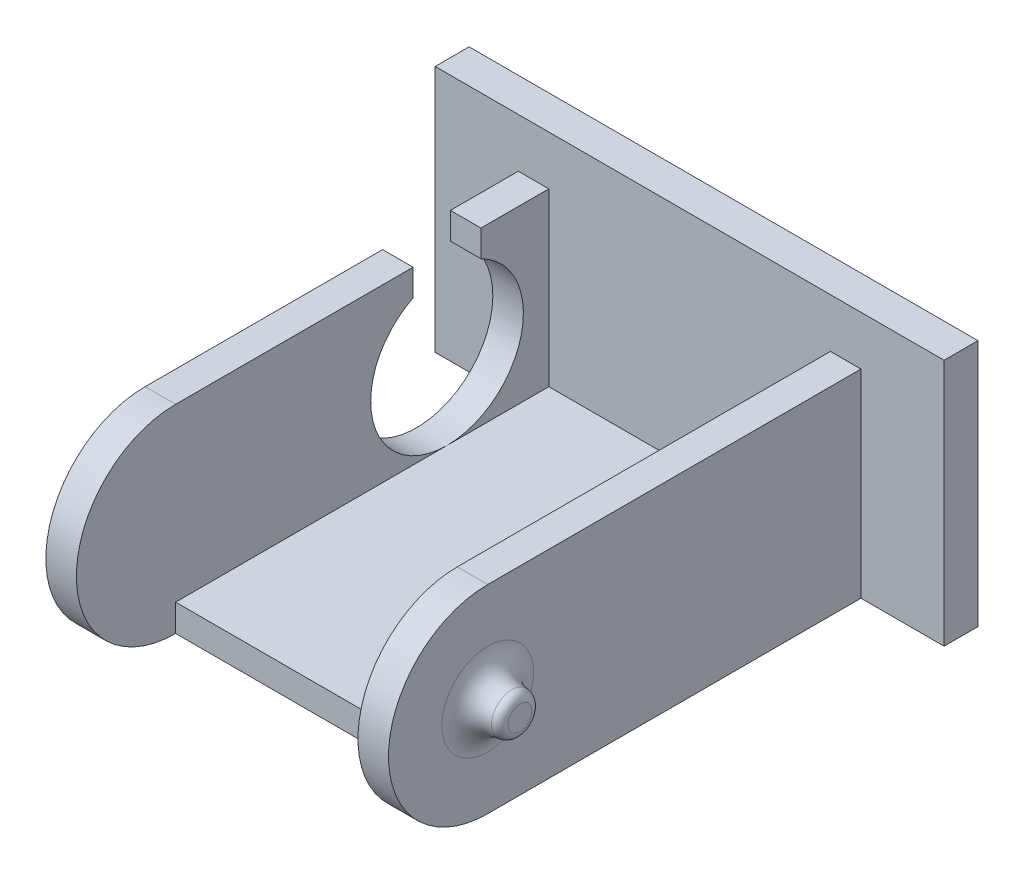
ISO-10303-21;
HEADER;
FILE_DESCRIPTION(('STEP AP214'),'2;1');
FILE_NAME('part.step','',(''),(''),'','','');
FILE_SCHEMA(('AUTOMOTIVE_DESIGN { 1 0 10303 214 1 1 1 1 }'));
ENDSEC;
DATA;
#1=APPLICATION_CONTEXT('core data for automotive mechanical design processes');
#2=APPLICATION_PROTOCOL_DEFINITION('international standard','automotive_design',2000,#1);
#3=PRODUCT_CONTEXT('',#1,'mechanical');
#4=PRODUCT('Part','Part','',(#3));
#5=PRODUCT_RELATED_PRODUCT_CATEGORY('part','',(#4));
#6=PRODUCT_DEFINITION_FORMATION('','',#4);
#7=PRODUCT_DEFINITION_CONTEXT('part definition',#1,'design');
#8=PRODUCT_DEFINITION('design','',#6,#7);
#9=PRODUCT_DEFINITION_SHAPE('','',#8);
#10=(LENGTH_UNIT() NAMED_UNIT(*) SI_UNIT(.MILLI.,.METRE.));
#11=(NAMED_UNIT(*) PLANE_ANGLE_UNIT() SI_UNIT($,.RADIAN.));
#12=(NAMED_UNIT(*) SI_UNIT($,.STERADIAN.) SOLID_ANGLE_UNIT());
#13=UNCERTAINTY_MEASURE_WITH_UNIT(LENGTH_MEASURE(1.E-05),#10,'distance_accuracy_value','');
#14=(GEOMETRIC_REPRESENTATION_CONTEXT(3) GLOBAL_UNCERTAINTY_ASSIGNED_CONTEXT((#13)) GLOBAL_UNIT_ASSIGNED_CONTEXT((#10,
#11,#12)) REPRESENTATION_CONTEXT('',''));
#15=CARTESIAN_POINT('',(0.,0.,0.));
#16=DIRECTION('',(0.,0.,1.));
#17=DIRECTION('',(1.,0.,0.));
#18=AXIS2_PLACEMENT_3D('',#15,#16,#17);
#19=CARTESIAN_POINT('',(-8.3,5.85,6.));
#20=DIRECTION('',(-1.,0.,0.));
#21=DIRECTION('',(0.,0.,-1.));
#22=AXIS2_PLACEMENT_3D('',#19,#20,#21);
#23=PLANE('',#22);
#24=DIRECTION('',(0.,0.,1.));
#25=VECTOR('',#24,1.);
#26=CARTESIAN_POINT('',(-8.3,11.7,6.));
#27=LINE('',#26,#25);
#28=CARTESIAN_POINT('',(-8.3,11.7,-16.));
#29=VERTEX_POINT('',#28);
#30=CARTESIAN_POINT('',(-8.3,11.7,-12.));
#31=VERTEX_POINT('',#30);
#32=EDGE_CURVE('E221',#29,#31,#27,.T.);
#33=ORIENTED_EDGE('',*,*,#32,.T.);
#34=DIRECTION('',(0.,1.,0.));
#35=VECTOR('',#34,1.);
#36=CARTESIAN_POINT('',(-8.3,10.1311288741493,-12.));
#37=LINE('',#36,#35);
#38=CARTESIAN_POINT('',(-8.3,10.1311288741493,-12.));
#39=VERTEX_POINT('',#38);
#40=EDGE_CURVE('E309',#39,#31,#37,.T.);
#41=ORIENTED_EDGE('',*,*,#40,.F.);
#42=CARTESIAN_POINT('',(-8.3,6.1,-10.));
#43=DIRECTION('',(1.,0.,0.));
#44=DIRECTION('',(0.,0.,-1.));
#45=AXIS2_PLACEMENT_3D('',#42,#43,#44);
#46=CIRCLE('',#45,4.5);
#47=CARTESIAN_POINT('',(-8.3,1.6,-10.));
#48=VERTEX_POINT('',#47);
#49=EDGE_CURVE('E308',#48,#39,#46,.T.);
#50=ORIENTED_EDGE('',*,*,#49,.F.);
#51=DIRECTION('',(0.,0.,1.));
#52=VECTOR('',#51,1.);
#53=CARTESIAN_POINT('',(-8.3,1.6,0.));
#54=LINE('',#53,#52);
#55=CARTESIAN_POINT('',(-8.3,1.6,-16.));
#56=VERTEX_POINT('',#55);
#57=EDGE_CURVE('E233',#56,#48,#54,.T.);
#58=ORIENTED_EDGE('',*,*,#57,.F.);
#59=DIRECTION('',(0.,-1.,0.));
#60=VECTOR('',#59,1.);
#61=CARTESIAN_POINT('',(-8.3,11.7,-16.));
#62=LINE('',#61,#60);
#63=EDGE_CURVE('E200',#29,#56,#62,.T.);
#64=ORIENTED_EDGE('',*,*,#63,.F.);
#65=EDGE_LOOP('',(#33,#41,#50,#58,#64));
#66=FACE_BOUND('',#65,.T.);
#67=ADVANCED_FACE('F33',(#66),#23,.F.);
#68=CARTESIAN_POINT('',(-8.3,11.7,6.));
#69=DIRECTION('',(0.,-1.,0.));
#70=DIRECTION('',(0.,0.,-1.));
#71=AXIS2_PLACEMENT_3D('',#68,#69,#70);
#72=PLANE('',#71);
#73=DIRECTION('',(0.,0.,1.));
#74=VECTOR('',#73,1.);
#75=CARTESIAN_POINT('',(-10.1,11.7,6.));
#76=LINE('',#75,#74);
#77=CARTESIAN_POINT('',(-10.1,11.7,-16.));
#78=VERTEX_POINT('',#77);
#79=CARTESIAN_POINT('',(-10.1,11.7,-12.));
#80=VERTEX_POINT('',#79);
#81=EDGE_CURVE('E220',#78,#80,#76,.T.);
#82=ORIENTED_EDGE('',*,*,#81,.T.);
#83=DIRECTION('',(1.,0.,0.));
#84=VECTOR('',#83,1.);
#85=CARTESIAN_POINT('',(-8.3,11.7,-12.));
#86=LINE('',#85,#84);
#87=EDGE_CURVE('E11',#80,#31,#86,.T.);
#88=ORIENTED_EDGE('',*,*,#87,.T.);
#89=ORIENTED_EDGE('',*,*,#32,.F.);
#90=DIRECTION('',(1.,0.,0.));
#91=VECTOR('',#90,1.);
#92=CARTESIAN_POINT('',(-10.1,11.7,-16.));
#93=LINE('',#92,#91);
#94=EDGE_CURVE('E197',#78,#29,#93,.T.);
#95=ORIENTED_EDGE('',*,*,#94,.F.);
#96=EDGE_LOOP('',(#82,#88,#89,#95));
#97=FACE_BOUND('',#96,.T.);
#98=ADVANCED_FACE('F373',(#97),#72,.F.);
#99=CARTESIAN_POINT('',(-10.1,1.6,6.));
#100=DIRECTION('',(0.,0.,-1.));
#101=DIRECTION('',(-1.,0.,0.));
#102=AXIS2_PLACEMENT_3D('',#99,#100,#101);
#103=PLANE('',#102);
#104=DIRECTION('',(0.,1.,0.));
#105=VECTOR('',#104,1.);
#106=CARTESIAN_POINT('',(-8.3,1.6,6.));
#107=LINE('',#106,#105);
#108=CARTESIAN_POINT('',(-8.3,0.,6.));
#109=VERTEX_POINT('',#108);
#110=CARTESIAN_POINT('',(-8.3,1.6,6.));
#111=VERTEX_POINT('',#110);
#112=EDGE_CURVE('E236',#109,#111,#107,.T.);
#113=ORIENTED_EDGE('',*,*,#112,.F.);
#114=DIRECTION('',(1.,0.,0.));
#115=VECTOR('',#114,1.);
#116=CARTESIAN_POINT('',(-10.1,0.,6.));
#117=LINE('',#116,#115);
#118=CARTESIAN_POINT('',(8.3,0.,6.));
#119=VERTEX_POINT('',#118);
#120=EDGE_CURVE('E269',#109,#119,#117,.T.);
#121=ORIENTED_EDGE('',*,*,#120,.T.);
#122=DIRECTION('',(0.,-1.,0.));
#123=VECTOR('',#122,1.);
#124=CARTESIAN_POINT('',(8.3,1.6,6.));
#125=LINE('',#124,#123);
#126=CARTESIAN_POINT('',(8.3,1.6,6.));
#127=VERTEX_POINT('',#126);
#128=EDGE_CURVE('E258',#127,#119,#125,.T.);
#129=ORIENTED_EDGE('',*,*,#128,.F.);
#130=DIRECTION('',(1.,0.,0.));
#131=VECTOR('',#130,1.);
#132=CARTESIAN_POINT('',(-10.1,1.6,6.));
#133=LINE('',#132,#131);
#134=EDGE_CURVE('E262',#111,#127,#133,.T.);
#135=ORIENTED_EDGE('',*,*,#134,.F.);
#136=EDGE_LOOP('',(#113,#121,#129,#135));
#137=FACE_BOUND('',#136,.T.);
#138=ADVANCED_FACE('F351',(#137),#103,.F.);
#139=CARTESIAN_POINT('',(0.,1.6,0.));
#140=DIRECTION('',(0.,1.,0.));
#141=DIRECTION('',(0.,0.,1.));
#142=AXIS2_PLACEMENT_3D('',#139,#140,#141);
#143=PLANE('',#142);
#144=DIRECTION('',(0.,0.,-1.));
#145=VECTOR('',#144,1.);
#146=CARTESIAN_POINT('',(8.3,1.6,0.));
#147=LINE('',#146,#145);
#148=CARTESIAN_POINT('',(8.3,1.6,-16.));
#149=VERTEX_POINT('',#148);
#150=EDGE_CURVE('E254',#127,#149,#147,.T.);
#151=ORIENTED_EDGE('',*,*,#150,.T.);
#152=DIRECTION('',(1.,0.,0.));
#153=VECTOR('',#152,1.);
#154=CARTESIAN_POINT('',(-8.3,1.6,-16.));
#155=LINE('',#154,#153);
#156=EDGE_CURVE('E203',#56,#149,#155,.T.);
#157=ORIENTED_EDGE('',*,*,#156,.F.);
#158=ORIENTED_EDGE('',*,*,#57,.T.);
#159=EDGE_CURVE('E232',#48,#111,#54,.T.);
#160=ORIENTED_EDGE('',*,*,#159,.T.);
#161=ORIENTED_EDGE('',*,*,#134,.T.);
#162=EDGE_LOOP('',(#151,#157,#158,#160,#161));
#163=FACE_BOUND('',#162,.T.);
#164=ADVANCED_FACE('F353',(#163),#143,.T.);
#165=CARTESIAN_POINT('',(10.1,1.6,-6.));
#166=DIRECTION('',(-1.,0.,0.));
#167=DIRECTION('',(0.,0.,1.));
#168=AXIS2_PLACEMENT_3D('',#165,#166,#167);
#169=PLANE('',#168);
#170=CARTESIAN_POINT('',(10.1,5.85,6.));
#171=DIRECTION('',(-1.,0.,0.));
#172=DIRECTION('',(0.,0.,1.));
#173=AXIS2_PLACEMENT_3D('',#170,#171,#172);
#174=CIRCLE('',#173,2.7);
#175=CARTESIAN_POINT('',(10.1,5.85,8.7));
#176=VERTEX_POINT('',#175);
#177=EDGE_CURVE('E264',#176,#176,#174,.T.);
#178=ORIENTED_EDGE('',*,*,#177,.T.);
#179=EDGE_LOOP('',(#178));
#180=FACE_BOUND('',#179,.T.);
#181=CARTESIAN_POINT('',(10.1,5.85,6.));
#182=DIRECTION('',(1.,0.,0.));
#183=DIRECTION('',(0.,0.,-1.));
#184=AXIS2_PLACEMENT_3D('',#181,#182,#183);
#185=CIRCLE('',#184,5.85);
#186=CARTESIAN_POINT('',(10.1,11.7,6.));
#187=VERTEX_POINT('',#186);
#188=CARTESIAN_POINT('',(10.1,0.,6.));
#189=VERTEX_POINT('',#188);
#190=EDGE_CURVE('E239',#187,#189,#185,.T.);
#191=ORIENTED_EDGE('',*,*,#190,.T.);
#192=DIRECTION('',(0.,0.,-1.));
#193=VECTOR('',#192,1.);
#194=CARTESIAN_POINT('',(10.1,0.,-6.));
#195=LINE('',#194,#193);
#196=CARTESIAN_POINT('',(10.1,0.,-16.));
#197=VERTEX_POINT('',#196);
#198=EDGE_CURVE('E261',#189,#197,#195,.T.);
#199=ORIENTED_EDGE('',*,*,#198,.T.);
#200=DIRECTION('',(0.,-1.,0.));
#201=VECTOR('',#200,1.);
#202=CARTESIAN_POINT('',(10.1,11.7,-16.));
#203=LINE('',#202,#201);
#204=CARTESIAN_POINT('',(10.1,11.7,-16.));
#205=VERTEX_POINT('',#204);
#206=EDGE_CURVE('E212',#205,#197,#203,.T.);
#207=ORIENTED_EDGE('',*,*,#206,.F.);
#208=DIRECTION('',(0.,0.,1.));
#209=VECTOR('',#208,1.);
#210=CARTESIAN_POINT('',(10.1,11.7,6.));
#211=LINE('',#210,#209);
#212=EDGE_CURVE('E244',#205,#187,#211,.T.);
#213=ORIENTED_EDGE('',*,*,#212,.T.);
#214=EDGE_LOOP('',(#191,#199,#207,#213));
#215=FACE_BOUND('',#214,.T.);
#216=ADVANCED_FACE('F339',(#180,#215),#169,.F.);
#217=CARTESIAN_POINT('',(-10.1,1.6,-6.));
#218=DIRECTION('',(1.,0.,0.));
#219=DIRECTION('',(0.,0.,-1.));
#220=AXIS2_PLACEMENT_3D('',#217,#218,#219);
#221=PLANE('',#220);
#222=CARTESIAN_POINT('',(-10.1,5.85,6.));
#223=DIRECTION('',(1.,0.,0.));
#224=DIRECTION('',(0.,0.,-1.));
#225=AXIS2_PLACEMENT_3D('',#222,#223,#224);
#226=CIRCLE('',#225,2.7);
#227=CARTESIAN_POINT('',(-10.1,5.85,3.3));
#228=VERTEX_POINT('',#227);
#229=EDGE_CURVE('E280',#228,#228,#226,.T.);
#230=ORIENTED_EDGE('',*,*,#229,.T.);
#231=EDGE_LOOP('',(#230));
#232=FACE_BOUND('',#231,.T.);
#233=CARTESIAN_POINT('',(-10.1,6.1,-10.));
#234=DIRECTION('',(1.,0.,0.));
#235=DIRECTION('',(0.,0.,-1.));
#236=AXIS2_PLACEMENT_3D('',#233,#234,#235);
#237=CIRCLE('',#236,4.5);
#238=CARTESIAN_POINT('',(-10.1,10.1311288741493,-8.));
#239=VERTEX_POINT('',#238);
#240=CARTESIAN_POINT('',(-10.1,10.1311288741493,-12.));
#241=VERTEX_POINT('',#240);
#242=EDGE_CURVE('E177',#239,#241,#237,.T.);
#243=ORIENTED_EDGE('',*,*,#242,.T.);
#244=DIRECTION('',(0.,1.,0.));
#245=VECTOR('',#244,1.);
#246=CARTESIAN_POINT('',(-10.1,1.6,-12.));
#247=LINE('',#246,#245);
#248=EDGE_CURVE('E182',#241,#80,#247,.T.);
#249=ORIENTED_EDGE('',*,*,#248,.T.);
#250=ORIENTED_EDGE('',*,*,#81,.F.);
#251=DIRECTION('',(0.,1.,0.));
#252=VECTOR('',#251,1.);
#253=CARTESIAN_POINT('',(-10.1,0.,-16.));
#254=LINE('',#253,#252);
#255=CARTESIAN_POINT('',(-10.1,0.,-16.));
#256=VERTEX_POINT('',#255);
#257=EDGE_CURVE('E195',#256,#78,#254,.T.);
#258=ORIENTED_EDGE('',*,*,#257,.F.);
#259=DIRECTION('',(0.,0.,1.));
#260=VECTOR('',#259,1.);
#261=CARTESIAN_POINT('',(-10.1,0.,-6.));
#262=LINE('',#261,#260);
#263=CARTESIAN_POINT('',(-10.1,0.,6.));
#264=VERTEX_POINT('',#263);
#265=EDGE_CURVE('E157',#256,#264,#262,.T.);
#266=ORIENTED_EDGE('',*,*,#265,.T.);
#267=CARTESIAN_POINT('',(-10.1,5.85,6.));
#268=DIRECTION('',(1.,0.,0.));
#269=DIRECTION('',(0.,0.,-1.));
#270=AXIS2_PLACEMENT_3D('',#267,#268,#269);
#271=CIRCLE('',#270,5.85);
#272=CARTESIAN_POINT('',(-10.1,11.7,6.));
#273=VERTEX_POINT('',#272);
#274=EDGE_CURVE('E215',#273,#264,#271,.T.);
#275=ORIENTED_EDGE('',*,*,#274,.F.);
#276=CARTESIAN_POINT('',(-10.1,11.7,-8.));
#277=VERTEX_POINT('',#276);
#278=EDGE_CURVE('E227',#277,#273,#76,.T.);
#279=ORIENTED_EDGE('',*,*,#278,.F.);
#280=DIRECTION('',(0.,-1.,0.));
#281=VECTOR('',#280,1.);
#282=CARTESIAN_POINT('',(-10.1,1.6,-8.));
#283=LINE('',#282,#281);
#284=EDGE_CURVE('E56',#277,#239,#283,.T.);
#285=ORIENTED_EDGE('',*,*,#284,.T.);
#286=EDGE_LOOP('',(#243,#249,#250,#258,#266,#275,#279,#285));
#287=FACE_BOUND('',#286,.T.);
#288=ADVANCED_FACE('F297',(#232,#287),#221,.F.);
#289=CARTESIAN_POINT('',(0.,0.,0.));
#290=DIRECTION('',(0.,1.,0.));
#291=DIRECTION('',(0.,0.,1.));
#292=AXIS2_PLACEMENT_3D('',#289,#290,#291);
#293=PLANE('',#292);
#294=ORIENTED_EDGE('',*,*,#265,.F.);
#295=DIRECTION('',(1.,0.,0.));
#296=VECTOR('',#295,1.);
#297=CARTESIAN_POINT('',(15.,0.,-16.));
#298=LINE('',#297,#296);
#299=CARTESIAN_POINT('',(-15.,0.,-16.));
#300=VERTEX_POINT('',#299);
#301=EDGE_CURVE('E154',#300,#256,#298,.T.);
#302=ORIENTED_EDGE('',*,*,#301,.F.);
#303=DIRECTION('',(0.,0.,-1.));
#304=VECTOR('',#303,1.);
#305=CARTESIAN_POINT('',(-15.,0.,-16.));
#306=LINE('',#305,#304);
#307=CARTESIAN_POINT('',(-15.,0.,-18.));
#308=VERTEX_POINT('',#307);
#309=EDGE_CURVE('E48',#300,#308,#306,.T.);
#310=ORIENTED_EDGE('',*,*,#309,.T.);
#311=DIRECTION('',(1.,0.,0.));
#312=VECTOR('',#311,1.);
#313=CARTESIAN_POINT('',(15.,0.,-18.));
#314=LINE('',#313,#312);
#315=CARTESIAN_POINT('',(15.,0.,-18.));
#316=VERTEX_POINT('',#315);
#317=EDGE_CURVE('E329',#308,#316,#314,.T.);
#318=ORIENTED_EDGE('',*,*,#317,.T.);
#319=DIRECTION('',(0.,0.,-1.));
#320=VECTOR('',#319,1.);
#321=CARTESIAN_POINT('',(15.,0.,-16.));
#322=LINE('',#321,#320);
#323=CARTESIAN_POINT('',(15.,0.,-16.));
#324=VERTEX_POINT('',#323);
#325=EDGE_CURVE('E171',#324,#316,#322,.T.);
#326=ORIENTED_EDGE('',*,*,#325,.F.);
#327=EDGE_CURVE('E162',#197,#324,#298,.T.);
#328=ORIENTED_EDGE('',*,*,#327,.F.);
#329=ORIENTED_EDGE('',*,*,#198,.F.);
#330=DIRECTION('',(1.,0.,0.));
#331=VECTOR('',#330,1.);
#332=CARTESIAN_POINT('',(8.3,0.,6.));
#333=LINE('',#332,#331);
#334=EDGE_CURVE('E247',#119,#189,#333,.T.);
#335=ORIENTED_EDGE('',*,*,#334,.F.);
#336=ORIENTED_EDGE('',*,*,#120,.F.);
#337=EDGE_CURVE('E265',#264,#109,#117,.T.);
#338=ORIENTED_EDGE('',*,*,#337,.F.);
#339=EDGE_LOOP('',(#294,#302,#310,#318,#326,#328,#329,#335,#336,#338));
#340=FACE_BOUND('',#339,.T.);
#341=ADVANCED_FACE('F155',(#340),#293,.F.);
#342=CARTESIAN_POINT('',(8.3,5.85,6.));
#343=DIRECTION('',(1.,0.,0.));
#344=DIRECTION('',(0.,0.,-1.));
#345=AXIS2_PLACEMENT_3D('',#342,#343,#344);
#346=PLANE('',#345);
#347=ORIENTED_EDGE('',*,*,#150,.F.);
#348=ORIENTED_EDGE('',*,*,#128,.T.);
#349=CARTESIAN_POINT('',(8.3,5.85,6.));
#350=DIRECTION('',(1.,0.,0.));
#351=DIRECTION('',(0.,0.,-1.));
#352=AXIS2_PLACEMENT_3D('',#349,#350,#351);
#353=CIRCLE('',#352,5.85);
#354=CARTESIAN_POINT('',(8.3,11.7,6.));
#355=VERTEX_POINT('',#354);
#356=EDGE_CURVE('E240',#355,#119,#353,.T.);
#357=ORIENTED_EDGE('',*,*,#356,.F.);
#358=DIRECTION('',(0.,0.,1.));
#359=VECTOR('',#358,1.);
#360=CARTESIAN_POINT('',(8.3,11.7,6.));
#361=LINE('',#360,#359);
#362=CARTESIAN_POINT('',(8.3,11.7,-16.));
#363=VERTEX_POINT('',#362);
#364=EDGE_CURVE('E243',#363,#355,#361,.T.);
#365=ORIENTED_EDGE('',*,*,#364,.F.);
#366=DIRECTION('',(0.,1.,0.));
#367=VECTOR('',#366,1.);
#368=CARTESIAN_POINT('',(8.3,1.6,-16.));
#369=LINE('',#368,#367);
#370=EDGE_CURVE('E206',#149,#363,#369,.T.);
#371=ORIENTED_EDGE('',*,*,#370,.F.);
#372=EDGE_LOOP('',(#347,#348,#357,#365,#371));
#373=FACE_BOUND('',#372,.T.);
#374=ADVANCED_FACE('F347',(#373),#346,.F.);
#375=CARTESIAN_POINT('',(8.3,5.85,6.));
#376=DIRECTION('',(1.,0.,0.));
#377=DIRECTION('',(0.,0.,-1.));
#378=AXIS2_PLACEMENT_3D('',#375,#376,#377);
#379=CYLINDRICAL_SURFACE('',#378,5.85);
#380=ORIENTED_EDGE('',*,*,#190,.F.);
#381=DIRECTION('',(1.,0.,0.));
#382=VECTOR('',#381,1.);
#383=CARTESIAN_POINT('',(8.3,11.7,6.));
#384=LINE('',#383,#382);
#385=EDGE_CURVE('E252',#355,#187,#384,.T.);
#386=ORIENTED_EDGE('',*,*,#385,.F.);
#387=ORIENTED_EDGE('',*,*,#356,.T.);
#388=ORIENTED_EDGE('',*,*,#334,.T.);
#389=EDGE_LOOP('',(#380,#386,#387,#388));
#390=FACE_BOUND('',#389,.T.);
#391=ADVANCED_FACE('F342',(#390),#379,.T.);
#392=CARTESIAN_POINT('',(8.3,11.7,6.));
#393=DIRECTION('',(0.,1.,0.));
#394=DIRECTION('',(0.,0.,1.));
#395=AXIS2_PLACEMENT_3D('',#392,#393,#394);
#396=PLANE('',#395);
#397=ORIENTED_EDGE('',*,*,#212,.F.);
#398=DIRECTION('',(1.,0.,0.));
#399=VECTOR('',#398,1.);
#400=CARTESIAN_POINT('',(8.3,11.7,-16.));
#401=LINE('',#400,#399);
#402=EDGE_CURVE('E209',#363,#205,#401,.T.);
#403=ORIENTED_EDGE('',*,*,#402,.F.);
#404=ORIENTED_EDGE('',*,*,#364,.T.);
#405=ORIENTED_EDGE('',*,*,#385,.T.);
#406=EDGE_LOOP('',(#397,#403,#404,#405));
#407=FACE_BOUND('',#406,.T.);
#408=ADVANCED_FACE('F429',(#407),#396,.T.);
#409=CARTESIAN_POINT('',(12.,5.85,6.));
#410=DIRECTION('',(1.,0.,0.));
#411=DIRECTION('',(0.,0.,-1.));
#412=AXIS2_PLACEMENT_3D('',#409,#410,#411);
#413=PLANE('',#412);
#414=CARTESIAN_POINT('',(12.,5.85,6.));
#415=DIRECTION('',(1.,0.,0.));
#416=DIRECTION('',(0.,0.,-1.));
#417=AXIS2_PLACEMENT_3D('',#414,#415,#416);
#418=CIRCLE('',#417,0.702501564456181);
#419=CARTESIAN_POINT('',(12.,5.85,5.29749843554382));
#420=VERTEX_POINT('',#419);
#421=EDGE_CURVE('E274',#420,#420,#418,.T.);
#422=ORIENTED_EDGE('',*,*,#421,.T.);
#423=EDGE_LOOP('',(#422));
#424=FACE_BOUND('',#423,.T.);
#425=ADVANCED_FACE('F394',(#424),#413,.T.);
#426=CARTESIAN_POINT('',(11.6,5.85,6.));
#427=DIRECTION('',(-1.,0.,0.));
#428=DIRECTION('',(0.,0.,1.));
#429=AXIS2_PLACEMENT_3D('',#426,#427,#428);
#430=TOROIDAL_SURFACE('',#429,2.7,1.5);
#431=CARTESIAN_POINT('',(11.525,5.85,6.));
#432=DIRECTION('',(1.,0.,0.));
#433=DIRECTION('',(0.,0.,-1.));
#434=AXIS2_PLACEMENT_3D('',#431,#432,#433);
#435=CIRCLE('',#434,1.20187617334214);
#436=CARTESIAN_POINT('',(11.525,5.85,4.79812382665786));
#437=VERTEX_POINT('',#436);
#438=EDGE_CURVE('E277',#437,#437,#435,.F.);
#439=ORIENTED_EDGE('',*,*,#438,.T.);
#440=EDGE_LOOP('',(#439));
#441=FACE_BOUND('',#440,.T.);
#442=ORIENTED_EDGE('',*,*,#177,.F.);
#443=EDGE_LOOP('',(#442));
#444=FACE_BOUND('',#443,.T.);
#445=ADVANCED_FACE('F388',(#441,#444),#430,.F.);
#446=CARTESIAN_POINT('',(11.5,5.85,6.));
#447=DIRECTION('',(-1.,0.,0.));
#448=DIRECTION('',(0.,0.,1.));
#449=AXIS2_PLACEMENT_3D('',#446,#447,#448);
#450=TOROIDAL_SURFACE('',#449,0.702501564456181,0.5);
#451=ORIENTED_EDGE('',*,*,#438,.F.);
#452=EDGE_LOOP('',(#451));
#453=FACE_BOUND('',#452,.T.);
#454=ORIENTED_EDGE('',*,*,#421,.F.);
#455=EDGE_LOOP('',(#454));
#456=FACE_BOUND('',#455,.T.);
#457=ADVANCED_FACE('F382',(#453,#456),#450,.T.);
#458=ORIENTED_EDGE('',*,*,#159,.F.);
#459=CARTESIAN_POINT('',(-8.3,10.1311288741493,-8.));
#460=VERTEX_POINT('',#459);
#461=EDGE_CURVE('E307',#460,#48,#46,.T.);
#462=ORIENTED_EDGE('',*,*,#461,.F.);
#463=DIRECTION('',(0.,-1.,0.));
#464=VECTOR('',#463,1.);
#465=CARTESIAN_POINT('',(-8.3,10.1311288741493,-8.));
#466=LINE('',#465,#464);
#467=CARTESIAN_POINT('',(-8.3,11.7,-8.));
#468=VERTEX_POINT('',#467);
#469=EDGE_CURVE('E306',#468,#460,#466,.T.);
#470=ORIENTED_EDGE('',*,*,#469,.F.);
#471=CARTESIAN_POINT('',(-8.3,11.7,6.));
#472=VERTEX_POINT('',#471);
#473=EDGE_CURVE('E219',#468,#472,#27,.T.);
#474=ORIENTED_EDGE('',*,*,#473,.T.);
#475=CARTESIAN_POINT('',(-8.3,5.85,6.));
#476=DIRECTION('',(1.,0.,0.));
#477=DIRECTION('',(0.,0.,-1.));
#478=AXIS2_PLACEMENT_3D('',#475,#476,#477);
#479=CIRCLE('',#478,5.85);
#480=EDGE_CURVE('E216',#472,#109,#479,.T.);
#481=ORIENTED_EDGE('',*,*,#480,.T.);
#482=ORIENTED_EDGE('',*,*,#112,.T.);
#483=EDGE_LOOP('',(#458,#462,#470,#474,#481,#482));
#484=FACE_BOUND('',#483,.T.);
#485=ADVANCED_FACE('F303',(#484),#23,.F.);
#486=CARTESIAN_POINT('',(-8.3,5.85,6.));
#487=DIRECTION('',(-1.,0.,0.));
#488=DIRECTION('',(0.,0.,1.));
#489=AXIS2_PLACEMENT_3D('',#486,#487,#488);
#490=CYLINDRICAL_SURFACE('',#489,5.85);
#491=ORIENTED_EDGE('',*,*,#274,.T.);
#492=ORIENTED_EDGE('',*,*,#337,.T.);
#493=ORIENTED_EDGE('',*,*,#480,.F.);
#494=DIRECTION('',(-1.,0.,0.));
#495=VECTOR('',#494,1.);
#496=CARTESIAN_POINT('',(-8.3,11.7,6.));
#497=LINE('',#496,#495);
#498=EDGE_CURVE('E224',#472,#273,#497,.T.);
#499=ORIENTED_EDGE('',*,*,#498,.T.);
#500=EDGE_LOOP('',(#491,#492,#493,#499));
#501=FACE_BOUND('',#500,.T.);
#502=ADVANCED_FACE('F299',(#501),#490,.T.);
#503=ORIENTED_EDGE('',*,*,#473,.F.);
#504=DIRECTION('',(-1.,0.,0.));
#505=VECTOR('',#504,1.);
#506=CARTESIAN_POINT('',(-8.3,11.7,-8.));
#507=LINE('',#506,#505);
#508=EDGE_CURVE('E41',#468,#277,#507,.T.);
#509=ORIENTED_EDGE('',*,*,#508,.T.);
#510=ORIENTED_EDGE('',*,*,#278,.T.);
#511=ORIENTED_EDGE('',*,*,#498,.F.);
#512=EDGE_LOOP('',(#503,#509,#510,#511));
#513=FACE_BOUND('',#512,.T.);
#514=ADVANCED_FACE('F291',(#513),#72,.F.);
#515=CARTESIAN_POINT('',(-12.,5.85,6.));
#516=DIRECTION('',(-1.,0.,0.));
#517=DIRECTION('',(0.,0.,-1.));
#518=AXIS2_PLACEMENT_3D('',#515,#516,#517);
#519=PLANE('',#518);
#520=CARTESIAN_POINT('',(-12.,5.85,6.));
#521=DIRECTION('',(-1.,0.,0.));
#522=DIRECTION('',(0.,0.,1.));
#523=AXIS2_PLACEMENT_3D('',#520,#521,#522);
#524=CIRCLE('',#523,0.702501564456181);
#525=CARTESIAN_POINT('',(-12.,5.85,6.70250156445618));
#526=VERTEX_POINT('',#525);
#527=EDGE_CURVE('E286',#526,#526,#524,.T.);
#528=ORIENTED_EDGE('',*,*,#527,.T.);
#529=EDGE_LOOP('',(#528));
#530=FACE_BOUND('',#529,.T.);
#531=ADVANCED_FACE('F402',(#530),#519,.T.);
#532=CARTESIAN_POINT('',(-11.6,5.85,6.));
#533=DIRECTION('',(1.,0.,0.));
#534=DIRECTION('',(0.,0.,-1.));
#535=AXIS2_PLACEMENT_3D('',#532,#533,#534);
#536=TOROIDAL_SURFACE('',#535,2.7,1.5);
#537=CARTESIAN_POINT('',(-11.525,5.85,6.));
#538=DIRECTION('',(-1.,0.,0.));
#539=DIRECTION('',(0.,0.,1.));
#540=AXIS2_PLACEMENT_3D('',#537,#538,#539);
#541=CIRCLE('',#540,1.20187617334214);
#542=CARTESIAN_POINT('',(-11.525,5.85,7.20187617334213));
#543=VERTEX_POINT('',#542);
#544=EDGE_CURVE('E283',#543,#543,#541,.F.);
#545=ORIENTED_EDGE('',*,*,#544,.T.);
#546=EDGE_LOOP('',(#545));
#547=FACE_BOUND('',#546,.T.);
#548=ORIENTED_EDGE('',*,*,#229,.F.);
#549=EDGE_LOOP('',(#548));
#550=FACE_BOUND('',#549,.T.);
#551=ADVANCED_FACE('F400',(#547,#550),#536,.F.);
#552=CARTESIAN_POINT('',(-11.5,5.85,6.));
#553=DIRECTION('',(1.,0.,0.));
#554=DIRECTION('',(0.,0.,-1.));
#555=AXIS2_PLACEMENT_3D('',#552,#553,#554);
#556=TOROIDAL_SURFACE('',#555,0.702501564456181,0.5);
#557=ORIENTED_EDGE('',*,*,#527,.F.);
#558=EDGE_LOOP('',(#557));
#559=FACE_BOUND('',#558,.T.);
#560=ORIENTED_EDGE('',*,*,#544,.F.);
#561=EDGE_LOOP('',(#560));
#562=FACE_BOUND('',#561,.T.);
#563=ADVANCED_FACE('F35',(#559,#562),#556,.T.);
#564=CARTESIAN_POINT('',(0.,0.,-16.));
#565=DIRECTION('',(0.,0.,-1.));
#566=DIRECTION('',(-1.,0.,0.));
#567=AXIS2_PLACEMENT_3D('',#564,#565,#566);
#568=PLANE('',#567);
#569=DIRECTION('',(0.,1.,0.));
#570=VECTOR('',#569,1.);
#571=CARTESIAN_POINT('',(-15.,14.6,-16.));
#572=LINE('',#571,#570);
#573=CARTESIAN_POINT('',(-15.,14.6,-16.));
#574=VERTEX_POINT('',#573);
#575=EDGE_CURVE('E168',#300,#574,#572,.T.);
#576=ORIENTED_EDGE('',*,*,#575,.F.);
#577=ORIENTED_EDGE('',*,*,#301,.T.);
#578=ORIENTED_EDGE('',*,*,#257,.T.);
#579=ORIENTED_EDGE('',*,*,#94,.T.);
#580=ORIENTED_EDGE('',*,*,#63,.T.);
#581=ORIENTED_EDGE('',*,*,#156,.T.);
#582=ORIENTED_EDGE('',*,*,#370,.T.);
#583=ORIENTED_EDGE('',*,*,#402,.T.);
#584=ORIENTED_EDGE('',*,*,#206,.T.);
#585=ORIENTED_EDGE('',*,*,#327,.T.);
#586=DIRECTION('',(0.,-1.,0.));
#587=VECTOR('',#586,1.);
#588=CARTESIAN_POINT('',(15.,14.6,-16.));
#589=LINE('',#588,#587);
#590=CARTESIAN_POINT('',(15.,14.6,-16.));
#591=VERTEX_POINT('',#590);
#592=EDGE_CURVE('E179',#591,#324,#589,.T.);
#593=ORIENTED_EDGE('',*,*,#592,.F.);
#594=DIRECTION('',(1.,0.,0.));
#595=VECTOR('',#594,1.);
#596=CARTESIAN_POINT('',(15.,14.6,-16.));
#597=LINE('',#596,#595);
#598=EDGE_CURVE('E175',#574,#591,#597,.T.);
#599=ORIENTED_EDGE('',*,*,#598,.F.);
#600=EDGE_LOOP('',(#576,#577,#578,#579,#580,#581,#582,#583,#584,#585,#593,#599));
#601=FACE_BOUND('',#600,.T.);
#602=ADVANCED_FACE('F173',(#601),#568,.F.);
#603=CARTESIAN_POINT('',(-15.,14.6,-18.));
#604=DIRECTION('',(1.,0.,0.));
#605=DIRECTION('',(0.,1.,0.));
#606=AXIS2_PLACEMENT_3D('',#603,#604,#605);
#607=PLANE('',#606);
#608=DIRECTION('',(0.,1.,0.));
#609=VECTOR('',#608,1.);
#610=CARTESIAN_POINT('',(-15.,14.6,-18.));
#611=LINE('',#610,#609);
#612=CARTESIAN_POINT('',(-15.,14.6,-18.));
#613=VERTEX_POINT('',#612);
#614=EDGE_CURVE('E170',#308,#613,#611,.T.);
#615=ORIENTED_EDGE('',*,*,#614,.F.);
#616=ORIENTED_EDGE('',*,*,#309,.F.);
#617=ORIENTED_EDGE('',*,*,#575,.T.);
#618=DIRECTION('',(0.,0.,1.));
#619=VECTOR('',#618,1.);
#620=CARTESIAN_POINT('',(-15.,14.6,-18.));
#621=LINE('',#620,#619);
#622=EDGE_CURVE('E193',#613,#574,#621,.T.);
#623=ORIENTED_EDGE('',*,*,#622,.F.);
#624=EDGE_LOOP('',(#615,#616,#617,#623));
#625=FACE_BOUND('',#624,.T.);
#626=ADVANCED_FACE('F166',(#625),#607,.F.);
#627=CARTESIAN_POINT('',(15.,14.6,-18.));
#628=DIRECTION('',(0.,-1.,0.));
#629=DIRECTION('',(0.,0.,-1.));
#630=AXIS2_PLACEMENT_3D('',#627,#628,#629);
#631=PLANE('',#630);
#632=ORIENTED_EDGE('',*,*,#598,.T.);
#633=DIRECTION('',(0.,0.,1.));
#634=VECTOR('',#633,1.);
#635=CARTESIAN_POINT('',(15.,14.6,-18.));
#636=LINE('',#635,#634);
#637=CARTESIAN_POINT('',(15.,14.6,-18.));
#638=VERTEX_POINT('',#637);
#639=EDGE_CURVE('E190',#638,#591,#636,.T.);
#640=ORIENTED_EDGE('',*,*,#639,.F.);
#641=DIRECTION('',(1.,0.,0.));
#642=VECTOR('',#641,1.);
#643=CARTESIAN_POINT('',(15.,14.6,-18.));
#644=LINE('',#643,#642);
#645=EDGE_CURVE('E322',#613,#638,#644,.T.);
#646=ORIENTED_EDGE('',*,*,#645,.F.);
#647=ORIENTED_EDGE('',*,*,#622,.T.);
#648=EDGE_LOOP('',(#632,#640,#646,#647));
#649=FACE_BOUND('',#648,.T.);
#650=ADVANCED_FACE('F484',(#649),#631,.F.);
#651=CARTESIAN_POINT('',(15.,14.6,-18.));
#652=DIRECTION('',(-1.,0.,0.));
#653=DIRECTION('',(0.,-1.,0.));
#654=AXIS2_PLACEMENT_3D('',#651,#652,#653);
#655=PLANE('',#654);
#656=ORIENTED_EDGE('',*,*,#592,.T.);
#657=ORIENTED_EDGE('',*,*,#325,.T.);
#658=DIRECTION('',(0.,-1.,0.));
#659=VECTOR('',#658,1.);
#660=CARTESIAN_POINT('',(15.,14.6,-18.));
#661=LINE('',#660,#659);
#662=EDGE_CURVE('E185',#638,#316,#661,.T.);
#663=ORIENTED_EDGE('',*,*,#662,.F.);
#664=ORIENTED_EDGE('',*,*,#639,.T.);
#665=EDGE_LOOP('',(#656,#657,#663,#664));
#666=FACE_BOUND('',#665,.T.);
#667=ADVANCED_FACE('F332',(#666),#655,.F.);
#668=CARTESIAN_POINT('',(0.,0.,-18.));
#669=DIRECTION('',(0.,0.,-1.));
#670=DIRECTION('',(-1.,0.,0.));
#671=AXIS2_PLACEMENT_3D('',#668,#669,#670);
#672=PLANE('',#671);
#673=ORIENTED_EDGE('',*,*,#317,.F.);
#674=ORIENTED_EDGE('',*,*,#614,.T.);
#675=ORIENTED_EDGE('',*,*,#645,.T.);
#676=ORIENTED_EDGE('',*,*,#662,.T.);
#677=EDGE_LOOP('',(#673,#674,#675,#676));
#678=FACE_BOUND('',#677,.T.);
#679=ADVANCED_FACE('F328',(#678),#672,.T.);
#680=CARTESIAN_POINT('',(-10.3,6.1,-10.));
#681=DIRECTION('',(1.,0.,0.));
#682=DIRECTION('',(0.,0.,-1.));
#683=AXIS2_PLACEMENT_3D('',#680,#681,#682);
#684=CYLINDRICAL_SURFACE('',#683,4.5);
#685=DIRECTION('',(1.,0.,0.));
#686=VECTOR('',#685,1.);
#687=CARTESIAN_POINT('',(-10.3,10.1311288741493,-8.));
#688=LINE('',#687,#686);
#689=EDGE_CURVE('E315',#239,#460,#688,.T.);
#690=ORIENTED_EDGE('',*,*,#689,.T.);
#691=ORIENTED_EDGE('',*,*,#461,.T.);
#692=ORIENTED_EDGE('',*,*,#49,.T.);
#693=DIRECTION('',(1.,0.,0.));
#694=VECTOR('',#693,1.);
#695=CARTESIAN_POINT('',(-10.3,10.1311288741493,-12.));
#696=LINE('',#695,#694);
#697=EDGE_CURVE('E316',#241,#39,#696,.T.);
#698=ORIENTED_EDGE('',*,*,#697,.F.);
#699=ORIENTED_EDGE('',*,*,#242,.F.);
#700=EDGE_LOOP('',(#690,#691,#692,#698,#699));
#701=FACE_BOUND('',#700,.T.);
#702=ADVANCED_FACE('F361',(#701),#684,.F.);
#703=CARTESIAN_POINT('',(-10.3,10.1311288741493,-12.));
#704=DIRECTION('',(0.,0.,-1.));
#705=DIRECTION('',(-1.,0.,0.));
#706=AXIS2_PLACEMENT_3D('',#703,#704,#705);
#707=PLANE('',#706);
#708=ORIENTED_EDGE('',*,*,#697,.T.);
#709=ORIENTED_EDGE('',*,*,#40,.T.);
#710=ORIENTED_EDGE('',*,*,#87,.F.);
#711=ORIENTED_EDGE('',*,*,#248,.F.);
#712=EDGE_LOOP('',(#708,#709,#710,#711));
#713=FACE_BOUND('',#712,.T.);
#714=ADVANCED_FACE('F364',(#713),#707,.F.);
#715=CARTESIAN_POINT('',(-10.3,10.1311288741493,-8.));
#716=DIRECTION('',(0.,0.,1.));
#717=DIRECTION('',(1.,0.,0.));
#718=AXIS2_PLACEMENT_3D('',#715,#716,#717);
#719=PLANE('',#718);
#720=ORIENTED_EDGE('',*,*,#508,.F.);
#721=ORIENTED_EDGE('',*,*,#469,.T.);
#722=ORIENTED_EDGE('',*,*,#689,.F.);
#723=ORIENTED_EDGE('',*,*,#284,.F.);
#724=EDGE_LOOP('',(#720,#721,#722,#723));
#725=FACE_BOUND('',#724,.T.);
#726=ADVANCED_FACE('F362',(#725),#719,.F.);
#727=CLOSED_SHELL('',(#67,#98,#138,#164,#216,#288,#341,#374,#391,#408,#425,#445,#457,#485,#502,
#514,#531,#551,#563,#602,#626,#650,#667,#679,#702,#714,#726));
#728=MANIFOLD_SOLID_BREP('B2',#727);
#729=ADVANCED_BREP_SHAPE_REPRESENTATION('',(#18,#728),#14);
#730=SHAPE_DEFINITION_REPRESENTATION(#9,#729);
ENDSEC;
END-ISO-10303-21;
